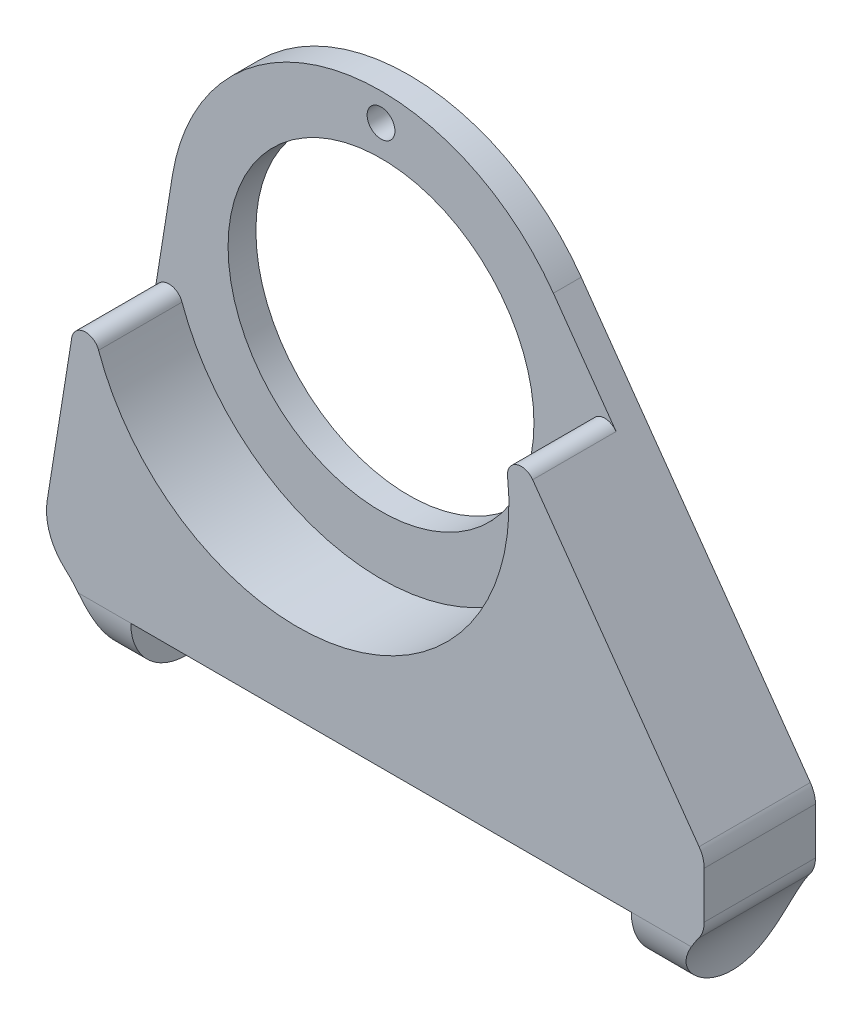
ISO-10303-21;
HEADER;
FILE_DESCRIPTION(('STEP AP214'),'2;1');
FILE_NAME('part.step','',(''),(''),'','','');
FILE_SCHEMA(('AUTOMOTIVE_DESIGN { 1 0 10303 214 1 1 1 1 }'));
ENDSEC;
DATA;
#1=APPLICATION_CONTEXT('core data for automotive mechanical design processes');
#2=APPLICATION_PROTOCOL_DEFINITION('international standard','automotive_design',2000,#1);
#3=PRODUCT_CONTEXT('',#1,'mechanical');
#4=PRODUCT('Part','Part','',(#3));
#5=PRODUCT_RELATED_PRODUCT_CATEGORY('part','',(#4));
#6=PRODUCT_DEFINITION_FORMATION('','',#4);
#7=PRODUCT_DEFINITION_CONTEXT('part definition',#1,'design');
#8=PRODUCT_DEFINITION('design','',#6,#7);
#9=PRODUCT_DEFINITION_SHAPE('','',#8);
#10=(LENGTH_UNIT() NAMED_UNIT(*) SI_UNIT(.MILLI.,.METRE.));
#11=(NAMED_UNIT(*) PLANE_ANGLE_UNIT() SI_UNIT($,.RADIAN.));
#12=(NAMED_UNIT(*) SI_UNIT($,.STERADIAN.) SOLID_ANGLE_UNIT());
#13=UNCERTAINTY_MEASURE_WITH_UNIT(LENGTH_MEASURE(1.E-05),#10,'distance_accuracy_value','');
#14=(GEOMETRIC_REPRESENTATION_CONTEXT(3) GLOBAL_UNCERTAINTY_ASSIGNED_CONTEXT((#13)) GLOBAL_UNIT_ASSIGNED_CONTEXT((#10,
#11,#12)) REPRESENTATION_CONTEXT('',''));
#15=CARTESIAN_POINT('',(0.,0.,0.));
#16=DIRECTION('',(0.,0.,1.));
#17=DIRECTION('',(1.,0.,0.));
#18=AXIS2_PLACEMENT_3D('',#15,#16,#17);
#19=CARTESIAN_POINT('',(-35.1529531364286,-52.3924267994827,10.));
#20=DIRECTION('',(-1.,0.,0.));
#21=DIRECTION('',(0.,0.,1.));
#22=AXIS2_PLACEMENT_3D('',#19,#20,#21);
#23=CYLINDRICAL_SURFACE('',#22,10.);
#24=CARTESIAN_POINT('',(-30.,-52.3924267994827,10.));
#25=DIRECTION('',(1.,0.,0.));
#26=DIRECTION('',(0.,0.,-1.));
#27=AXIS2_PLACEMENT_3D('',#24,#25,#26);
#28=CIRCLE('',#27,10.);
#29=CARTESIAN_POINT('',(-30.,-52.3924267994827,20.));
#30=VERTEX_POINT('',#29);
#31=CARTESIAN_POINT('',(-30.,-52.3924267994827,0.));
#32=VERTEX_POINT('',#31);
#33=EDGE_CURVE('E53',#30,#32,#28,.T.);
#34=ORIENTED_EDGE('',*,*,#33,.F.);
#35=DIRECTION('',(-1.,0.,0.));
#36=VECTOR('',#35,1.);
#37=CARTESIAN_POINT('',(73.1163853827035,-52.3924267994827,20.));
#38=LINE('',#37,#36);
#39=CARTESIAN_POINT('',(-39.4299255812802,-52.3924267994827,20.));
#40=VERTEX_POINT('',#39);
#41=EDGE_CURVE('E79',#30,#40,#38,.T.);
#42=ORIENTED_EDGE('',*,*,#41,.T.);
#43=CARTESIAN_POINT('',(-39.4299255812802,-52.3924267994827,20.));
#44=CARTESIAN_POINT('',(-39.3366220687245,-52.5111090935359,19.999999330762));
#45=CARTESIAN_POINT('',(-39.24467044055,-52.6308414926383,19.9978867756354));
#46=CARTESIAN_POINT('',(-39.0635651683623,-52.8722661888648,19.9892118401067));
#47=CARTESIAN_POINT('',(-38.9744118554305,-52.9939587153422,19.9826489352244));
#48=CARTESIAN_POINT('',(-38.7112010580915,-53.3618944527533,19.9559338374954));
#49=CARTESIAN_POINT('',(-38.5415230671002,-53.6108299610111,19.9287546283468));
#50=CARTESIAN_POINT('',(-38.2141961091669,-54.1150033123771,19.8538296248108));
#51=CARTESIAN_POINT('',(-38.0566011857026,-54.3702633990138,19.8059971317999));
#52=CARTESIAN_POINT('',(-37.7551381261347,-54.8837289905072,19.6882789131739));
#53=CARTESIAN_POINT('',(-37.6112658299277,-55.1419335759745,19.6183998989558));
#54=CARTESIAN_POINT('',(-37.337041982633,-55.6602630431236,19.4549214072005));
#55=CARTESIAN_POINT('',(-37.206779830574,-55.9203899019105,19.3611774892748));
#56=CARTESIAN_POINT('',(-36.9612170584597,-56.4378931862962,19.1494455626398));
#57=CARTESIAN_POINT('',(-36.8459179623069,-56.6952693293047,19.0314550877127));
#58=CARTESIAN_POINT('',(-36.6306784301974,-57.2031914428053,18.7714144832709));
#59=CARTESIAN_POINT('',(-36.5306954580004,-57.4537546794312,18.6294333785582));
#60=CARTESIAN_POINT('',(-36.3453921120126,-57.9454151265018,18.3215633905807));
#61=CARTESIAN_POINT('',(-36.2600698617295,-58.186513545339,18.1556775719935));
#62=CARTESIAN_POINT('',(-36.1119931287387,-58.6301660327219,17.820435877087));
#63=CARTESIAN_POINT('',(-36.047788994485,-58.8340442238142,17.6534646886783));
#64=CARTESIAN_POINT('',(-35.9297092648523,-59.2295669854497,17.302289933838));
#65=CARTESIAN_POINT('',(-35.8758329348111,-59.4212124255151,17.118087594522));
#66=CARTESIAN_POINT('',(-35.7774794187983,-59.7904884227159,16.7334855491487));
#67=CARTESIAN_POINT('',(-35.7330108380044,-59.9681060565027,16.5330712437638));
#68=CARTESIAN_POINT('',(-35.6525377802396,-60.3074104750995,16.1175952172354));
#69=CARTESIAN_POINT('',(-35.6165333742724,-60.4690971262621,15.9025333732371));
#70=CARTESIAN_POINT('',(-35.5526016134226,-60.7719394942125,15.4638235635278));
#71=CARTESIAN_POINT('',(-35.5245249144532,-60.9134458175753,15.2404390893383));
#72=CARTESIAN_POINT('',(-35.4745153004868,-61.1785727884145,14.7826362580631));
#73=CARTESIAN_POINT('',(-35.4525825499257,-61.3021929571453,14.5482176058562));
#74=CARTESIAN_POINT('',(-35.4139496661938,-61.5305073230335,14.0700902435148));
#75=CARTESIAN_POINT('',(-35.3972466519187,-61.6352119274321,13.8263867317886));
#76=CARTESIAN_POINT('',(-35.3682272372887,-61.8249937029222,13.3312124819461));
#77=CARTESIAN_POINT('',(-35.3559105902715,-61.910071977583,13.0797421814507));
#78=CARTESIAN_POINT('',(-35.3360170379392,-62.0524279388327,12.5964005008844));
#79=CARTESIAN_POINT('',(-35.3280872687199,-62.111644621117,12.3651120016741));
#80=CARTESIAN_POINT('',(-35.3147954543811,-62.2133946360928,11.8988233216591));
#81=CARTESIAN_POINT('',(-35.3094333460893,-62.2559283792309,11.6638232323177));
#82=CARTESIAN_POINT('',(-35.3009747579725,-62.3240869305703,11.1912727111729));
#83=CARTESIAN_POINT('',(-35.2978789445011,-62.349706765396,10.9537215500989));
#84=CARTESIAN_POINT('',(-35.2937731257563,-62.3838747053766,10.4774514992262));
#85=CARTESIAN_POINT('',(-35.2927625345312,-62.3924276063522,10.2387329563691));
#86=CARTESIAN_POINT('',(-35.2927614323456,-62.3924258624867,9.72276576464788));
#87=CARTESIAN_POINT('',(-35.2941229912089,-62.3808897719434,9.44551209186838));
#88=CARTESIAN_POINT('',(-35.2996802521267,-62.3348251802097,8.89293269610677));
#89=CARTESIAN_POINT('',(-35.3038762294533,-62.3002944458376,8.61760716300533));
#90=CARTESIAN_POINT('',(-35.3154382550796,-62.2084761345348,8.07073178578457));
#91=CARTESIAN_POINT('',(-35.3228055184301,-62.151179835823,7.7991834300664));
#92=CARTESIAN_POINT('',(-35.3412521656007,-62.0142617900652,7.26190902567436));
#93=CARTESIAN_POINT('',(-35.3523314579926,-61.9346405928944,6.99618283377104));
#94=CARTESIAN_POINT('',(-35.3789403116224,-61.7536430334011,6.47232934056427));
#95=CARTESIAN_POINT('',(-35.3944719889064,-61.6522563325446,6.21420571694398));
#96=CARTESIAN_POINT('',(-35.4308782865302,-61.4285620319465,5.7075721210572));
#97=CARTESIAN_POINT('',(-35.451752948939,-61.3062542674811,5.45906222450413));
#98=CARTESIAN_POINT('',(-35.499864672064,-61.0417492794358,4.97350531397001));
#99=CARTESIAN_POINT('',(-35.5271016509476,-60.8995523116812,4.73645815260205));
#100=CARTESIAN_POINT('',(-35.5890370346288,-60.5965349669535,4.27560897065876));
#101=CARTESIAN_POINT('',(-35.6237352929582,-60.4357149555874,4.05180669019067));
#102=CARTESIAN_POINT('',(-35.7011452070237,-60.0994538527645,3.62230238864861));
#103=CARTESIAN_POINT('',(-35.7437320986142,-59.9242613062654,3.41638333297936));
#104=CARTESIAN_POINT('',(-35.8382795944468,-59.5589788019134,3.020525794144));
#105=CARTESIAN_POINT('',(-35.8902400902045,-59.3688890164864,2.83058712606804));
#106=CARTESIAN_POINT('',(-36.0044200820581,-58.9759544555626,2.46816548777445));
#107=CARTESIAN_POINT('',(-36.066629628696,-58.7731221670862,2.29566584781051));
#108=CARTESIAN_POINT('',(-36.2021224342907,-58.3567062262291,1.9689727859117));
#109=CARTESIAN_POINT('',(-36.2754053607824,-58.1431228967639,1.81477881461894));
#110=CARTESIAN_POINT('',(-36.4311253860051,-57.7143901896846,1.53000341620893));
#111=CARTESIAN_POINT('',(-36.513202059612,-57.4995013659541,1.39883184568163));
#112=CARTESIAN_POINT('',(-36.6885801980579,-57.06402189573,1.15474675541451));
#113=CARTESIAN_POINT('',(-36.7818815311617,-56.8434313161774,1.04183302143312));
#114=CARTESIAN_POINT('',(-36.9799753794039,-56.3983280641732,0.834129215583045));
#115=CARTESIAN_POINT('',(-37.0847891845043,-56.1738087933166,0.739373642427734));
#116=CARTESIAN_POINT('',(-37.3056219132202,-55.7233951181868,0.567994840542597));
#117=CARTESIAN_POINT('',(-37.4216406497058,-55.4975007369377,0.491371309069431));
#118=CARTESIAN_POINT('',(-37.6762977301332,-55.0245189216058,0.34915475246827));
#119=CARTESIAN_POINT('',(-37.8160384741735,-54.7774902854037,0.285340103366601));
#120=CARTESIAN_POINT('',(-38.1080248933137,-54.2863923096206,0.177773990856303));
#121=CARTESIAN_POINT('',(-38.2602749850421,-54.0423240504557,0.134029649798268));
#122=CARTESIAN_POINT('',(-38.5759938023086,-53.559931285277,0.0654085401826111));
#123=CARTESIAN_POINT('',(-38.7394280674642,-53.3215919448294,0.0404764308406096));
#124=CARTESIAN_POINT('',(-39.0769076558199,-52.851644437408,0.00777193775637778));
#125=CARTESIAN_POINT('',(-39.2509432577528,-52.6200303829376,-1.59306423918359E-05));
#126=CARTESIAN_POINT('',(-39.4299255812802,-52.3924267994827,0.));
#127=B_SPLINE_CURVE_WITH_KNOTS('',3,(#43,#44,#45,#46,#47,#48,#49,#50,#51,#52,#53,#54,#55,#56,
#57,#58,#59,#60,#61,#62,#63,#64,#65,#66,#67,#68,#69,#70,#71,#72,#73,#74,#75,#76,#77,#78,#79,#80,
#81,#82,#83,#84,#85,#86,#87,#88,#89,#90,#91,#92,#93,#94,#95,#96,#97,#98,#99,#100,#101,#102,#103,
#104,#105,#106,#107,#108,#109,#110,#111,#112,#113,#114,#115,#116,#117,#118,#119,#120,#121,#122,
#123,#124,#125,#126),.UNSPECIFIED.,.F.,.F.,(4,2,2,2,2,2,2,2,2,2,2,2,2,2,2,2,2,2,2,2,2,2,2,2,2,2,
2,2,2,2,2,2,2,2,2,2,2,2,2,2,2,4),(0.,0.45285286404265,0.905759106730109,1.81220282585273,
2.72248919414524,3.63249872022485,4.54815268117253,5.46389982322623,6.37705573395974,
7.29009467851965,8.10279617676342,8.91543984249555,9.72882364215702,10.5422142648322,
11.3390663708785,12.1359398017401,12.9323734529397,13.7287623105397,14.4447893815855,
15.1607988352723,15.8770187311405,16.5930373403471,17.4245307153729,18.2561048547092,
19.0879978884756,19.9198704340379,20.7521389937399,21.5844141066831,22.416678515454,
23.2489265880069,24.068989521644,24.8890429649872,25.7083049668534,26.5275423762351,
27.3210122643684,28.1144728410712,28.9094262849189,29.7043664548151,30.5760305025076,
31.4480036388391,32.3174015431783,33.1860138857131),.UNSPECIFIED.);
#128=CARTESIAN_POINT('',(-39.4299255812801,-52.3924267994827,0.));
#129=VERTEX_POINT('',#128);
#130=EDGE_CURVE('E180',#40,#129,#127,.T.);
#131=ORIENTED_EDGE('',*,*,#130,.T.);
#132=DIRECTION('',(-1.,0.,0.));
#133=VECTOR('',#132,1.);
#134=CARTESIAN_POINT('',(73.1163853827035,-52.3924267994827,0.));
#135=LINE('',#134,#133);
#136=EDGE_CURVE('E87',#32,#129,#135,.T.);
#137=ORIENTED_EDGE('',*,*,#136,.F.);
#138=EDGE_LOOP('',(#34,#42,#131,#137));
#139=FACE_BOUND('',#138,.T.);
#140=ADVANCED_FACE('F44',(#139),#23,.T.);
#141=CARTESIAN_POINT('',(0.,0.,5.));
#142=DIRECTION('',(0.,0.,-1.));
#143=DIRECTION('',(-1.,0.,0.));
#144=AXIS2_PLACEMENT_3D('',#141,#142,#143);
#145=CYLINDRICAL_SURFACE('',#144,38.);
#146=DIRECTION('',(0.,0.,-1.));
#147=VECTOR('',#146,1.);
#148=CARTESIAN_POINT('',(-37.5209884030344,6.01460133835652,5.));
#149=LINE('',#148,#147);
#150=CARTESIAN_POINT('',(-37.5209884030344,6.01460133835652,5.));
#151=VERTEX_POINT('',#150);
#152=CARTESIAN_POINT('',(-37.5209884030344,6.01460133835652,0.));
#153=VERTEX_POINT('',#152);
#154=EDGE_CURVE('E216',#151,#153,#149,.T.);
#155=ORIENTED_EDGE('',*,*,#154,.F.);
#156=CARTESIAN_POINT('',(0.,0.,5.));
#157=DIRECTION('',(0.,0.,1.));
#158=DIRECTION('',(1.,0.,0.));
#159=AXIS2_PLACEMENT_3D('',#156,#157,#158);
#160=CIRCLE('',#159,38.);
#161=CARTESIAN_POINT('',(30.9950052682842,21.9843045925732,5.));
#162=VERTEX_POINT('',#161);
#163=EDGE_CURVE('E207',#162,#151,#160,.T.);
#164=ORIENTED_EDGE('',*,*,#163,.F.);
#165=DIRECTION('',(0.,0.,-1.));
#166=VECTOR('',#165,1.);
#167=CARTESIAN_POINT('',(30.9950052682842,21.9843045925732,5.));
#168=LINE('',#167,#166);
#169=CARTESIAN_POINT('',(30.9950052682842,21.9843045925732,0.));
#170=VERTEX_POINT('',#169);
#171=EDGE_CURVE('E210',#162,#170,#168,.T.);
#172=ORIENTED_EDGE('',*,*,#171,.T.);
#173=CARTESIAN_POINT('',(0.,0.,0.));
#174=DIRECTION('',(0.,0.,1.));
#175=DIRECTION('',(1.,0.,0.));
#176=AXIS2_PLACEMENT_3D('',#173,#174,#175);
#177=CIRCLE('',#176,38.);
#178=EDGE_CURVE('E204',#170,#153,#177,.T.);
#179=ORIENTED_EDGE('',*,*,#178,.T.);
#180=EDGE_LOOP('',(#155,#164,#172,#179));
#181=FACE_BOUND('',#180,.T.);
#182=ADVANCED_FACE('F311',(#181),#145,.T.);
#183=CARTESIAN_POINT('',(0.,0.,5.));
#184=DIRECTION('',(0.,0.,1.));
#185=DIRECTION('',(1.,0.,0.));
#186=AXIS2_PLACEMENT_3D('',#183,#184,#185);
#187=PLANE('',#186);
#188=CARTESIAN_POINT('',(0.,33.,5.));
#189=DIRECTION('',(0.,0.,1.));
#190=DIRECTION('',(1.,0.,0.));
#191=AXIS2_PLACEMENT_3D('',#188,#189,#190);
#192=CIRCLE('',#191,2.5);
#193=CARTESIAN_POINT('',(2.5,33.,5.));
#194=VERTEX_POINT('',#193);
#195=EDGE_CURVE('E201',#194,#194,#192,.T.);
#196=ORIENTED_EDGE('',*,*,#195,.F.);
#197=EDGE_LOOP('',(#196));
#198=FACE_BOUND('',#197,.T.);
#199=ORIENTED_EDGE('',*,*,#163,.T.);
#200=DIRECTION('',(0.158278982588329,0.987394431658799,0.));
#201=VECTOR('',#200,1.);
#202=CARTESIAN_POINT('',(-46.8836146172965,-52.3924267994827,5.));
#203=LINE('',#202,#201);
#204=CARTESIAN_POINT('',(-40.6064137878225,-13.2332595868192,5.));
#205=VERTEX_POINT('',#204);
#206=EDGE_CURVE('E234',#205,#151,#203,.T.);
#207=ORIENTED_EDGE('',*,*,#206,.F.);
#208=CARTESIAN_POINT('',(-38.1379277086755,-13.62895704329,5.));
#209=DIRECTION('',(0.,0.,1.));
#210=DIRECTION('',(1.,0.,0.));
#211=AXIS2_PLACEMENT_3D('',#208,#209,#210);
#212=CIRCLE('',#211,2.5);
#213=CARTESIAN_POINT('',(-35.7837346402387,-12.7876633986425,5.));
#214=VERTEX_POINT('',#213);
#215=EDGE_CURVE('E241',#205,#214,#212,.F.);
#216=ORIENTED_EDGE('',*,*,#215,.T.);
#217=CARTESIAN_POINT('',(37.7500167500985,4.35157849145371,5.));
#218=VERTEX_POINT('',#217);
#219=EDGE_CURVE('E211',#214,#218,#160,.T.);
#220=ORIENTED_EDGE('',*,*,#219,.T.);
#221=CARTESIAN_POINT('',(40.2335704836576,4.63786655010198,5.));
#222=DIRECTION('',(0.,0.,1.));
#223=DIRECTION('',(1.,0.,0.));
#224=AXIS2_PLACEMENT_3D('',#221,#222,#223);
#225=CIRCLE('',#224,2.5);
#226=CARTESIAN_POINT('',(42.2727155670974,6.08420237856073,5.));
#227=VERTEX_POINT('',#226);
#228=EDGE_CURVE('E239',#218,#227,#225,.F.);
#229=ORIENTED_EDGE('',*,*,#228,.T.);
#230=DIRECTION('',(0.578534331383504,-0.815658033375901,0.));
#231=VECTOR('',#230,1.);
#232=CARTESIAN_POINT('',(30.9950052682842,21.9843045925732,5.));
#233=LINE('',#232,#231);
#234=EDGE_CURVE('E226',#162,#227,#233,.T.);
#235=ORIENTED_EDGE('',*,*,#234,.F.);
#236=EDGE_LOOP('',(#199,#207,#216,#220,#229,#235));
#237=FACE_BOUND('',#236,.T.);
#238=CARTESIAN_POINT('',(0.,0.,5.));
#239=DIRECTION('',(0.,0.,1.));
#240=DIRECTION('',(1.,0.,0.));
#241=AXIS2_PLACEMENT_3D('',#238,#239,#240);
#242=CIRCLE('',#241,27.5);
#243=CARTESIAN_POINT('',(27.5,0.,5.));
#244=VERTEX_POINT('',#243);
#245=EDGE_CURVE('E193',#244,#244,#242,.T.);
#246=ORIENTED_EDGE('',*,*,#245,.F.);
#247=EDGE_LOOP('',(#246));
#248=FACE_BOUND('',#247,.T.);
#249=ADVANCED_FACE('F314',(#198,#237,#248),#187,.T.);
#250=CARTESIAN_POINT('',(0.,0.,0.));
#251=DIRECTION('',(0.,0.,1.));
#252=DIRECTION('',(1.,0.,0.));
#253=AXIS2_PLACEMENT_3D('',#250,#251,#252);
#254=PLANE('',#253);
#255=DIRECTION('',(0.,-1.,0.));
#256=VECTOR('',#255,1.);
#257=CARTESIAN_POINT('',(73.1163853827035,-37.4013536190073,0.));
#258=LINE('',#257,#256);
#259=CARTESIAN_POINT('',(73.1163853827035,-38.9945344954409,0.));
#260=VERTEX_POINT('',#259);
#261=CARTESIAN_POINT('',(73.1163853827035,-47.3924267994827,0.));
#262=VERTEX_POINT('',#261);
#263=EDGE_CURVE('E182',#260,#262,#258,.T.);
#264=ORIENTED_EDGE('',*,*,#263,.T.);
#265=CARTESIAN_POINT('',(68.1163853827035,-47.3924267994827,0.));
#266=DIRECTION('',(0.,0.,1.));
#267=DIRECTION('',(1.,0.,0.));
#268=AXIS2_PLACEMENT_3D('',#265,#266,#267);
#269=CIRCLE('',#268,5.);
#270=CARTESIAN_POINT('',(72.1163853827035,-50.3924267994827,0.));
#271=VERTEX_POINT('',#270);
#272=EDGE_CURVE('E257',#262,#271,#269,.F.);
#273=ORIENTED_EDGE('',*,*,#272,.T.);
#274=CARTESIAN_POINT('',(88.1163853827035,-62.3924267994827,0.));
#275=DIRECTION('',(0.,0.,1.));
#276=DIRECTION('',(1.,0.,0.));
#277=AXIS2_PLACEMENT_3D('',#274,#275,#276);
#278=CIRCLE('',#277,20.);
#279=CARTESIAN_POINT('',(70.7958773070147,-52.3924267994827,0.));
#280=VERTEX_POINT('',#279);
#281=EDGE_CURVE('E406',#271,#280,#278,.T.);
#282=ORIENTED_EDGE('',*,*,#281,.T.);
#283=CARTESIAN_POINT('',(60.,-52.3924267994827,0.));
#284=VERTEX_POINT('',#283);
#285=EDGE_CURVE('E67',#280,#284,#135,.T.);
#286=ORIENTED_EDGE('',*,*,#285,.T.);
#287=EDGE_CURVE('E173',#284,#32,#135,.T.);
#288=ORIENTED_EDGE('',*,*,#287,.T.);
#289=ORIENTED_EDGE('',*,*,#136,.T.);
#290=CARTESIAN_POINT('',(-55.1529531364286,-64.7531065744806,0.));
#291=DIRECTION('',(0.,0.,1.));
#292=DIRECTION('',(1.,0.,0.));
#293=AXIS2_PLACEMENT_3D('',#290,#291,#292);
#294=CIRCLE('',#293,20.);
#295=CARTESIAN_POINT('',(-41.8196198030953,-49.845986724482,0.));
#296=VERTEX_POINT('',#295);
#297=EDGE_CURVE('E279',#129,#296,#294,.T.);
#298=ORIENTED_EDGE('',*,*,#297,.T.);
#299=CARTESIAN_POINT('',(-35.1529531364286,-42.3924267994827,0.));
#300=DIRECTION('',(0.,0.,1.));
#301=DIRECTION('',(1.,0.,0.));
#302=AXIS2_PLACEMENT_3D('',#299,#300,#301);
#303=CIRCLE('',#302,10.);
#304=CARTESIAN_POINT('',(-45.0268974530166,-40.8096369735994,0.));
#305=VERTEX_POINT('',#304);
#306=EDGE_CURVE('E243',#296,#305,#303,.F.);
#307=ORIENTED_EDGE('',*,*,#306,.T.);
#308=DIRECTION('',(0.158278982588329,0.987394431658799,0.));
#309=VECTOR('',#308,1.);
#310=CARTESIAN_POINT('',(-46.8836146172965,-52.3924267994827,0.));
#311=LINE('',#310,#309);
#312=EDGE_CURVE('E187',#305,#153,#311,.T.);
#313=ORIENTED_EDGE('',*,*,#312,.T.);
#314=ORIENTED_EDGE('',*,*,#178,.F.);
#315=DIRECTION('',(0.578534331383504,-0.815658033375901,0.));
#316=VECTOR('',#315,1.);
#317=CARTESIAN_POINT('',(30.9950052682842,21.9843045925732,0.));
#318=LINE('',#317,#316);
#319=CARTESIAN_POINT('',(72.194675549583,-36.1018628385234,0.));
#320=VERTEX_POINT('',#319);
#321=EDGE_CURVE('E373',#170,#320,#318,.T.);
#322=ORIENTED_EDGE('',*,*,#321,.T.);
#323=CARTESIAN_POINT('',(68.1163853827035,-38.9945344954409,0.));
#324=DIRECTION('',(0.,0.,1.));
#325=DIRECTION('',(1.,0.,0.));
#326=AXIS2_PLACEMENT_3D('',#323,#324,#325);
#327=CIRCLE('',#326,5.);
#328=EDGE_CURVE('E255',#320,#260,#327,.F.);
#329=ORIENTED_EDGE('',*,*,#328,.T.);
#330=EDGE_LOOP('',(#264,#273,#282,#286,#288,#289,#298,#307,#313,#314,#322,#329));
#331=FACE_BOUND('',#330,.T.);
#332=CARTESIAN_POINT('',(0.,33.,0.));
#333=DIRECTION('',(0.,0.,1.));
#334=DIRECTION('',(1.,0.,0.));
#335=AXIS2_PLACEMENT_3D('',#332,#333,#334);
#336=CIRCLE('',#335,2.5);
#337=CARTESIAN_POINT('',(2.5,33.,0.));
#338=VERTEX_POINT('',#337);
#339=EDGE_CURVE('E196',#338,#338,#336,.T.);
#340=ORIENTED_EDGE('',*,*,#339,.T.);
#341=EDGE_LOOP('',(#340));
#342=FACE_BOUND('',#341,.T.);
#343=CARTESIAN_POINT('',(0.,0.,0.));
#344=DIRECTION('',(0.,0.,1.));
#345=DIRECTION('',(1.,0.,0.));
#346=AXIS2_PLACEMENT_3D('',#343,#344,#345);
#347=CIRCLE('',#346,27.5);
#348=CARTESIAN_POINT('',(27.5,0.,0.));
#349=VERTEX_POINT('',#348);
#350=EDGE_CURVE('E197',#349,#349,#347,.T.);
#351=ORIENTED_EDGE('',*,*,#350,.T.);
#352=EDGE_LOOP('',(#351));
#353=FACE_BOUND('',#352,.T.);
#354=ADVANCED_FACE('F185',(#331,#342,#353),#254,.F.);
#355=CARTESIAN_POINT('',(0.,33.,5.));
#356=DIRECTION('',(0.,0.,-1.));
#357=DIRECTION('',(-1.,0.,0.));
#358=AXIS2_PLACEMENT_3D('',#355,#356,#357);
#359=CYLINDRICAL_SURFACE('',#358,2.5);
#360=ORIENTED_EDGE('',*,*,#195,.T.);
#361=EDGE_LOOP('',(#360));
#362=FACE_BOUND('',#361,.T.);
#363=ORIENTED_EDGE('',*,*,#339,.F.);
#364=EDGE_LOOP('',(#363));
#365=FACE_BOUND('',#364,.T.);
#366=ADVANCED_FACE('F318',(#362,#365),#359,.F.);
#367=CARTESIAN_POINT('',(0.,0.,5.));
#368=DIRECTION('',(0.,0.,-1.));
#369=DIRECTION('',(-1.,0.,0.));
#370=AXIS2_PLACEMENT_3D('',#367,#368,#369);
#371=CYLINDRICAL_SURFACE('',#370,27.5);
#372=ORIENTED_EDGE('',*,*,#245,.T.);
#373=EDGE_LOOP('',(#372));
#374=FACE_BOUND('',#373,.T.);
#375=ORIENTED_EDGE('',*,*,#350,.F.);
#376=EDGE_LOOP('',(#375));
#377=FACE_BOUND('',#376,.T.);
#378=ADVANCED_FACE('F324',(#374,#377),#371,.F.);
#379=CARTESIAN_POINT('',(0.,0.,20.));
#380=DIRECTION('',(0.,0.,-1.));
#381=DIRECTION('',(-1.,0.,0.));
#382=AXIS2_PLACEMENT_3D('',#379,#380,#381);
#383=CYLINDRICAL_SURFACE('',#382,38.);
#384=CARTESIAN_POINT('',(0.,0.,20.));
#385=DIRECTION('',(0.,0.,1.));
#386=DIRECTION('',(-1.,0.,0.));
#387=AXIS2_PLACEMENT_3D('',#384,#385,#386);
#388=CIRCLE('',#387,38.);
#389=CARTESIAN_POINT('',(-35.7837346402387,-12.7876633986425,20.));
#390=VERTEX_POINT('',#389);
#391=CARTESIAN_POINT('',(37.7500167500985,4.35157849145371,20.));
#392=VERTEX_POINT('',#391);
#393=EDGE_CURVE('E192',#390,#392,#388,.T.);
#394=ORIENTED_EDGE('',*,*,#393,.T.);
#395=DIRECTION('',(0.,0.,-1.));
#396=VECTOR('',#395,1.);
#397=CARTESIAN_POINT('',(37.7500167500985,4.35157849145371,20.));
#398=LINE('',#397,#396);
#399=EDGE_CURVE('E221',#392,#218,#398,.T.);
#400=ORIENTED_EDGE('',*,*,#399,.T.);
#401=ORIENTED_EDGE('',*,*,#219,.F.);
#402=DIRECTION('',(0.,0.,-1.));
#403=VECTOR('',#402,1.);
#404=CARTESIAN_POINT('',(-35.7837346402387,-12.7876633986425,20.));
#405=LINE('',#404,#403);
#406=EDGE_CURVE('E219',#214,#390,#405,.F.);
#407=ORIENTED_EDGE('',*,*,#406,.T.);
#408=EDGE_LOOP('',(#394,#400,#401,#407));
#409=FACE_BOUND('',#408,.T.);
#410=ADVANCED_FACE('F328',(#409),#383,.F.);
#411=CARTESIAN_POINT('',(-46.8836146172965,-52.3924267994827,20.));
#412=DIRECTION('',(-0.987394431658799,0.158278982588329,0.));
#413=DIRECTION('',(-0.158278982588329,-0.987394431658799,0.));
#414=AXIS2_PLACEMENT_3D('',#411,#412,#413);
#415=PLANE('',#414);
#416=ORIENTED_EDGE('',*,*,#312,.F.);
#417=DIRECTION('',(0.,0.,-1.));
#418=VECTOR('',#417,1.);
#419=CARTESIAN_POINT('',(-45.0268974530166,-40.8096369735994,20.));
#420=LINE('',#419,#418);
#421=CARTESIAN_POINT('',(-45.0268974530166,-40.8096369735994,20.));
#422=VERTEX_POINT('',#421);
#423=EDGE_CURVE('E245',#305,#422,#420,.F.);
#424=ORIENTED_EDGE('',*,*,#423,.T.);
#425=DIRECTION('',(0.158278982588329,0.987394431658799,0.));
#426=VECTOR('',#425,1.);
#427=CARTESIAN_POINT('',(-46.8836146172965,-52.3924267994827,20.));
#428=LINE('',#427,#426);
#429=CARTESIAN_POINT('',(-40.6064137878225,-13.2332595868192,20.));
#430=VERTEX_POINT('',#429);
#431=EDGE_CURVE('E200',#422,#430,#428,.T.);
#432=ORIENTED_EDGE('',*,*,#431,.T.);
#433=DIRECTION('',(0.,0.,-1.));
#434=VECTOR('',#433,1.);
#435=CARTESIAN_POINT('',(-40.6064137878225,-13.2332595868192,20.));
#436=LINE('',#435,#434);
#437=EDGE_CURVE('E236',#430,#205,#436,.T.);
#438=ORIENTED_EDGE('',*,*,#437,.T.);
#439=ORIENTED_EDGE('',*,*,#206,.T.);
#440=ORIENTED_EDGE('',*,*,#154,.T.);
#441=EDGE_LOOP('',(#416,#424,#432,#438,#439,#440));
#442=FACE_BOUND('',#441,.T.);
#443=ADVANCED_FACE('F332',(#442),#415,.T.);
#444=CARTESIAN_POINT('',(73.1163853827035,-37.4013536190073,20.));
#445=DIRECTION('',(1.,0.,0.));
#446=DIRECTION('',(0.,0.,-1.));
#447=AXIS2_PLACEMENT_3D('',#444,#445,#446);
#448=PLANE('',#447);
#449=DIRECTION('',(0.,-1.,0.));
#450=VECTOR('',#449,1.);
#451=CARTESIAN_POINT('',(73.1163853827035,-37.4013536190073,20.));
#452=LINE('',#451,#450);
#453=CARTESIAN_POINT('',(73.1163853827035,-38.9945344954409,20.));
#454=VERTEX_POINT('',#453);
#455=CARTESIAN_POINT('',(73.1163853827035,-47.3924267994827,20.));
#456=VERTEX_POINT('',#455);
#457=EDGE_CURVE('E363',#454,#456,#452,.T.);
#458=ORIENTED_EDGE('',*,*,#457,.T.);
#459=DIRECTION('',(0.,0.,-1.));
#460=VECTOR('',#459,1.);
#461=CARTESIAN_POINT('',(73.1163853827035,-47.3924267994827,20.));
#462=LINE('',#461,#460);
#463=EDGE_CURVE('E252',#456,#262,#462,.T.);
#464=ORIENTED_EDGE('',*,*,#463,.T.);
#465=ORIENTED_EDGE('',*,*,#263,.F.);
#466=DIRECTION('',(0.,0.,-1.));
#467=VECTOR('',#466,1.);
#468=CARTESIAN_POINT('',(73.1163853827035,-38.9945344954409,20.));
#469=LINE('',#468,#467);
#470=EDGE_CURVE('E250',#260,#454,#469,.F.);
#471=ORIENTED_EDGE('',*,*,#470,.T.);
#472=EDGE_LOOP('',(#458,#464,#465,#471));
#473=FACE_BOUND('',#472,.T.);
#474=ADVANCED_FACE('F337',(#473),#448,.T.);
#475=CARTESIAN_POINT('',(30.9950052682842,21.9843045925732,20.));
#476=DIRECTION('',(0.815658033375901,0.578534331383504,0.));
#477=DIRECTION('',(-0.578534331383504,0.815658033375901,0.));
#478=AXIS2_PLACEMENT_3D('',#475,#476,#477);
#479=PLANE('',#478);
#480=DIRECTION('',(0.578534331383504,-0.815658033375901,0.));
#481=VECTOR('',#480,1.);
#482=CARTESIAN_POINT('',(30.9950052682842,21.9843045925732,20.));
#483=LINE('',#482,#481);
#484=CARTESIAN_POINT('',(42.2727155670974,6.08420237856072,20.));
#485=VERTEX_POINT('',#484);
#486=CARTESIAN_POINT('',(72.194675549583,-36.1018628385234,20.));
#487=VERTEX_POINT('',#486);
#488=EDGE_CURVE('E365',#485,#487,#483,.T.);
#489=ORIENTED_EDGE('',*,*,#488,.T.);
#490=DIRECTION('',(0.,0.,-1.));
#491=VECTOR('',#490,1.);
#492=CARTESIAN_POINT('',(72.194675549583,-36.1018628385233,20.));
#493=LINE('',#492,#491);
#494=EDGE_CURVE('E264',#487,#320,#493,.T.);
#495=ORIENTED_EDGE('',*,*,#494,.T.);
#496=ORIENTED_EDGE('',*,*,#321,.F.);
#497=ORIENTED_EDGE('',*,*,#171,.F.);
#498=ORIENTED_EDGE('',*,*,#234,.T.);
#499=DIRECTION('',(0.,0.,-1.));
#500=VECTOR('',#499,1.);
#501=CARTESIAN_POINT('',(42.2727155670974,6.08420237856073,20.));
#502=LINE('',#501,#500);
#503=EDGE_CURVE('E224',#227,#485,#502,.F.);
#504=ORIENTED_EDGE('',*,*,#503,.T.);
#505=EDGE_LOOP('',(#489,#495,#496,#497,#498,#504));
#506=FACE_BOUND('',#505,.T.);
#507=ADVANCED_FACE('F334',(#506),#479,.T.);
#508=CARTESIAN_POINT('',(0.,0.,20.));
#509=DIRECTION('',(0.,0.,-1.));
#510=DIRECTION('',(-1.,0.,0.));
#511=AXIS2_PLACEMENT_3D('',#508,#509,#510);
#512=PLANE('',#511);
#513=CARTESIAN_POINT('',(70.7958773070147,-52.3924267994827,20.));
#514=VERTEX_POINT('',#513);
#515=CARTESIAN_POINT('',(60.,-52.3924267994827,20.));
#516=VERTEX_POINT('',#515);
#517=EDGE_CURVE('E356',#514,#516,#38,.T.);
#518=ORIENTED_EDGE('',*,*,#517,.F.);
#519=CARTESIAN_POINT('',(88.1163853827035,-62.3924267994827,20.));
#520=DIRECTION('',(0.,0.,-1.));
#521=DIRECTION('',(-1.,0.,0.));
#522=AXIS2_PLACEMENT_3D('',#519,#520,#521);
#523=CIRCLE('',#522,20.);
#524=CARTESIAN_POINT('',(72.1163853827035,-50.3924267994827,20.));
#525=VERTEX_POINT('',#524);
#526=EDGE_CURVE('E398',#514,#525,#523,.T.);
#527=ORIENTED_EDGE('',*,*,#526,.T.);
#528=CARTESIAN_POINT('',(68.1163853827035,-47.3924267994827,20.));
#529=DIRECTION('',(0.,0.,-1.));
#530=DIRECTION('',(-1.,0.,0.));
#531=AXIS2_PLACEMENT_3D('',#528,#529,#530);
#532=CIRCLE('',#531,5.);
#533=EDGE_CURVE('E262',#525,#456,#532,.F.);
#534=ORIENTED_EDGE('',*,*,#533,.T.);
#535=ORIENTED_EDGE('',*,*,#457,.F.);
#536=CARTESIAN_POINT('',(68.1163853827035,-38.9945344954409,20.));
#537=DIRECTION('',(0.,0.,-1.));
#538=DIRECTION('',(-1.,0.,0.));
#539=AXIS2_PLACEMENT_3D('',#536,#537,#538);
#540=CIRCLE('',#539,5.);
#541=EDGE_CURVE('E260',#454,#487,#540,.F.);
#542=ORIENTED_EDGE('',*,*,#541,.T.);
#543=ORIENTED_EDGE('',*,*,#488,.F.);
#544=CARTESIAN_POINT('',(40.2335704836576,4.63786655010198,20.));
#545=DIRECTION('',(0.,0.,-1.));
#546=DIRECTION('',(-1.,0.,0.));
#547=AXIS2_PLACEMENT_3D('',#544,#545,#546);
#548=CIRCLE('',#547,2.5);
#549=EDGE_CURVE('E232',#485,#392,#548,.F.);
#550=ORIENTED_EDGE('',*,*,#549,.T.);
#551=ORIENTED_EDGE('',*,*,#393,.F.);
#552=CARTESIAN_POINT('',(-38.1379277086755,-13.62895704329,20.));
#553=DIRECTION('',(0.,0.,-1.));
#554=DIRECTION('',(-1.,0.,0.));
#555=AXIS2_PLACEMENT_3D('',#552,#553,#554);
#556=CIRCLE('',#555,2.5);
#557=EDGE_CURVE('E229',#390,#430,#556,.F.);
#558=ORIENTED_EDGE('',*,*,#557,.T.);
#559=ORIENTED_EDGE('',*,*,#431,.F.);
#560=CARTESIAN_POINT('',(-35.1529531364286,-42.3924267994827,20.));
#561=DIRECTION('',(0.,0.,-1.));
#562=DIRECTION('',(-1.,0.,0.));
#563=AXIS2_PLACEMENT_3D('',#560,#561,#562);
#564=CIRCLE('',#563,10.);
#565=CARTESIAN_POINT('',(-41.8196198030953,-49.845986724482,20.));
#566=VERTEX_POINT('',#565);
#567=EDGE_CURVE('E247',#422,#566,#564,.F.);
#568=ORIENTED_EDGE('',*,*,#567,.T.);
#569=CARTESIAN_POINT('',(-55.1529531364286,-64.7531065744806,20.));
#570=DIRECTION('',(0.,0.,-1.));
#571=DIRECTION('',(-1.,0.,0.));
#572=AXIS2_PLACEMENT_3D('',#569,#570,#571);
#573=CIRCLE('',#572,20.);
#574=EDGE_CURVE('E397',#566,#40,#573,.T.);
#575=ORIENTED_EDGE('',*,*,#574,.T.);
#576=ORIENTED_EDGE('',*,*,#41,.F.);
#577=EDGE_CURVE('E176',#516,#30,#38,.T.);
#578=ORIENTED_EDGE('',*,*,#577,.F.);
#579=EDGE_LOOP('',(#518,#527,#534,#535,#542,#543,#550,#551,#558,#559,#568,#575,#576,#578));
#580=FACE_BOUND('',#579,.T.);
#581=ADVANCED_FACE('F309',(#580),#512,.F.);
#582=CARTESIAN_POINT('',(40.2335704836576,4.63786655010198,20.));
#583=DIRECTION('',(0.,0.,-1.));
#584=DIRECTION('',(-1.,0.,0.));
#585=AXIS2_PLACEMENT_3D('',#582,#583,#584);
#586=CYLINDRICAL_SURFACE('',#585,2.5);
#587=ORIENTED_EDGE('',*,*,#549,.F.);
#588=ORIENTED_EDGE('',*,*,#503,.F.);
#589=ORIENTED_EDGE('',*,*,#228,.F.);
#590=ORIENTED_EDGE('',*,*,#399,.F.);
#591=EDGE_LOOP('',(#587,#588,#589,#590));
#592=FACE_BOUND('',#591,.T.);
#593=ADVANCED_FACE('F305',(#592),#586,.T.);
#594=CARTESIAN_POINT('',(-38.1379277086755,-13.62895704329,20.));
#595=DIRECTION('',(0.,0.,-1.));
#596=DIRECTION('',(-1.,0.,0.));
#597=AXIS2_PLACEMENT_3D('',#594,#595,#596);
#598=CYLINDRICAL_SURFACE('',#597,2.5);
#599=ORIENTED_EDGE('',*,*,#557,.F.);
#600=ORIENTED_EDGE('',*,*,#406,.F.);
#601=ORIENTED_EDGE('',*,*,#215,.F.);
#602=ORIENTED_EDGE('',*,*,#437,.F.);
#603=EDGE_LOOP('',(#599,#600,#601,#602));
#604=FACE_BOUND('',#603,.T.);
#605=ADVANCED_FACE('F301',(#604),#598,.T.);
#606=CARTESIAN_POINT('',(-35.1529531364286,-42.3924267994827,20.));
#607=DIRECTION('',(0.,0.,-1.));
#608=DIRECTION('',(-1.,0.,0.));
#609=AXIS2_PLACEMENT_3D('',#606,#607,#608);
#610=CYLINDRICAL_SURFACE('',#609,10.);
#611=ORIENTED_EDGE('',*,*,#306,.F.);
#612=DIRECTION('',(0.,0.,-1.));
#613=VECTOR('',#612,1.);
#614=CARTESIAN_POINT('',(-41.8196198030953,-49.845986724482,20.));
#615=LINE('',#614,#613);
#616=EDGE_CURVE('E267',#296,#566,#615,.F.);
#617=ORIENTED_EDGE('',*,*,#616,.T.);
#618=ORIENTED_EDGE('',*,*,#567,.F.);
#619=ORIENTED_EDGE('',*,*,#423,.F.);
#620=EDGE_LOOP('',(#611,#617,#618,#619));
#621=FACE_BOUND('',#620,.T.);
#622=ADVANCED_FACE('F297',(#621),#610,.T.);
#623=CARTESIAN_POINT('',(68.1163853827035,-47.3924267994827,20.));
#624=DIRECTION('',(0.,0.,-1.));
#625=DIRECTION('',(-1.,0.,0.));
#626=AXIS2_PLACEMENT_3D('',#623,#624,#625);
#627=CYLINDRICAL_SURFACE('',#626,5.);
#628=ORIENTED_EDGE('',*,*,#533,.F.);
#629=DIRECTION('',(0.,0.,-1.));
#630=VECTOR('',#629,1.);
#631=CARTESIAN_POINT('',(72.1163853827035,-50.3924267994827,20.));
#632=LINE('',#631,#630);
#633=EDGE_CURVE('E270',#525,#271,#632,.T.);
#634=ORIENTED_EDGE('',*,*,#633,.T.);
#635=ORIENTED_EDGE('',*,*,#272,.F.);
#636=ORIENTED_EDGE('',*,*,#463,.F.);
#637=EDGE_LOOP('',(#628,#634,#635,#636));
#638=FACE_BOUND('',#637,.T.);
#639=ADVANCED_FACE('F293',(#638),#627,.T.);
#640=CARTESIAN_POINT('',(68.1163853827035,-38.9945344954409,20.));
#641=DIRECTION('',(0.,0.,-1.));
#642=DIRECTION('',(-1.,0.,0.));
#643=AXIS2_PLACEMENT_3D('',#640,#641,#642);
#644=CYLINDRICAL_SURFACE('',#643,5.);
#645=ORIENTED_EDGE('',*,*,#541,.F.);
#646=ORIENTED_EDGE('',*,*,#470,.F.);
#647=ORIENTED_EDGE('',*,*,#328,.F.);
#648=ORIENTED_EDGE('',*,*,#494,.F.);
#649=EDGE_LOOP('',(#645,#646,#647,#648));
#650=FACE_BOUND('',#649,.T.);
#651=ADVANCED_FACE('F290',(#650),#644,.T.);
#652=ORIENTED_EDGE('',*,*,#517,.T.);
#653=CARTESIAN_POINT('',(60.,-52.3924267994827,10.));
#654=DIRECTION('',(1.,0.,0.));
#655=DIRECTION('',(0.,0.,-1.));
#656=AXIS2_PLACEMENT_3D('',#653,#654,#655);
#657=CIRCLE('',#656,10.);
#658=EDGE_CURVE('E11',#516,#284,#657,.T.);
#659=ORIENTED_EDGE('',*,*,#658,.T.);
#660=ORIENTED_EDGE('',*,*,#285,.F.);
#661=CARTESIAN_POINT('',(70.7958773070147,-52.3924267994827,0.));
#662=CARTESIAN_POINT('',(70.6567729671095,-52.6332735440032,-2.89828940717956E-05));
#663=CARTESIAN_POINT('',(70.5227294523134,-52.8771334633446,0.0087017338026928));
#664=CARTESIAN_POINT('',(70.2653532106928,-53.3692713124411,0.0447730549399425));
#665=CARTESIAN_POINT('',(70.1420271340983,-53.6175518717323,0.0721251223593889));
#666=CARTESIAN_POINT('',(69.906688715876,-54.116959492667,0.146582724708033));
#667=CARTESIAN_POINT('',(69.7946919233109,-54.3680899540763,0.193714962732602));
#668=CARTESIAN_POINT('',(69.5826994121422,-54.8706706599935,0.308523311292847));
#669=CARTESIAN_POINT('',(69.4827010492795,-55.1221208216543,0.376194883646425));
#670=CARTESIAN_POINT('',(69.2945446116514,-55.6240846793727,0.532909783371553));
#671=CARTESIAN_POINT('',(69.2064370269908,-55.8745902464332,0.622040031284394));
#672=CARTESIAN_POINT('',(69.042527249331,-56.3711068975987,0.821672258191989));
#673=CARTESIAN_POINT('',(68.9667260252104,-56.6171176264738,0.932175918413917));
#674=CARTESIAN_POINT('',(68.8272307965649,-57.1016805453448,1.17412031353332));
#675=CARTESIAN_POINT('',(68.7635185000335,-57.3402435401849,1.3055288538357));
#676=CARTESIAN_POINT('',(68.6474578261251,-57.8077912621146,1.58878567763748));
#677=CARTESIAN_POINT('',(68.5951087530572,-58.0367765748855,1.74063270890788));
#678=CARTESIAN_POINT('',(68.5036941727683,-58.4696267002914,2.05425894690047));
#679=CARTESIAN_POINT('',(68.4640262284223,-58.6741762707043,2.21491990973582));
#680=CARTESIAN_POINT('',(68.3930916898648,-59.0709356523271,2.55249317359919));
#681=CARTESIAN_POINT('',(68.3618247961869,-59.2631459032019,2.72940489504634));
#682=CARTESIAN_POINT('',(68.3066703858197,-59.6337456026026,3.09842568215625));
#683=CARTESIAN_POINT('',(68.282787323467,-59.8121266601723,3.29054383376016));
#684=CARTESIAN_POINT('',(68.2413510535169,-60.1535450742967,3.6885974872983));
#685=CARTESIAN_POINT('',(68.2237979912429,-60.316582078521,3.89453330632817));
#686=CARTESIAN_POINT('',(68.1936833975387,-60.6286441059799,4.3223271928861));
#687=CARTESIAN_POINT('',(68.1812085207898,-60.7773952301521,4.54439111614299));
#688=CARTESIAN_POINT('',(68.1605464349771,-61.0567198719553,4.99986012072974));
#689=CARTESIAN_POINT('',(68.152359309685,-61.1872930343994,5.23326542354352));
#690=CARTESIAN_POINT('',(68.1392187112676,-61.4293534365186,5.70984973829417));
#691=CARTESIAN_POINT('',(68.1342651868799,-61.5408409787381,5.95302859522556));
#692=CARTESIAN_POINT('',(68.1266414410995,-61.7439868230375,6.4475665270648));
#693=CARTESIAN_POINT('',(68.1239712174392,-61.8356451448099,6.69892559384855));
#694=CARTESIAN_POINT('',(68.1201664805958,-61.99567129547,7.19924344626618));
#695=CARTESIAN_POINT('',(68.1189813606287,-62.0647436102793,7.44797688302717));
#696=CARTESIAN_POINT('',(68.1173895710004,-62.1834533491449,7.95003819384821));
#697=CARTESIAN_POINT('',(68.1169828860774,-62.2330911542167,8.20336597773374));
#698=CARTESIAN_POINT('',(68.116502669988,-62.3126332647888,8.71313204766373));
#699=CARTESIAN_POINT('',(68.1164291796743,-62.3425351500989,8.96957071126613));
#700=CARTESIAN_POINT('',(68.1163863983612,-62.3824431340406,9.48400517084442));
#701=CARTESIAN_POINT('',(68.1164171130407,-62.3924481483128,9.74200105091851));
#702=CARTESIAN_POINT('',(68.1163853827035,-62.3924267994827,10.));
#703=B_SPLINE_CURVE_WITH_KNOTS('',3,(#661,#662,#663,#664,#665,#666,#667,#668,#669,#670,#671,
#672,#673,#674,#675,#676,#677,#678,#679,#680,#681,#682,#683,#684,#685,#686,#687,#688,#689,#690,
#691,#692,#693,#694,#695,#696,#697,#698,#699,#700,#701,#702),.UNSPECIFIED.,.F.,.F.,(4,2,2,2,2,2,
2,2,2,2,2,2,2,2,2,2,2,2,2,2,4),(0.,0.83431235028099,1.6691387536459,2.50509581083415,
3.340868296947,4.18008487221364,5.01936748690844,5.85736985767486,6.69532090891779,
7.48372262446205,8.2720962326863,9.06094450777075,9.84981089198666,10.6516249580703,
11.4534546889452,12.2552717080681,13.0570879308976,13.8307645145585,14.6044259294532,
15.378182199828,16.1519806379826),.UNSPECIFIED.);
#704=CARTESIAN_POINT('',(68.1163853827035,-62.3924267994827,10.));
#705=VERTEX_POINT('',#704);
#706=EDGE_CURVE('E169',#280,#705,#703,.T.);
#707=ORIENTED_EDGE('',*,*,#706,.T.);
#708=CARTESIAN_POINT('',(68.1163853827035,-62.3924267994827,10.));
#709=CARTESIAN_POINT('',(68.1164296456082,-62.3924567433406,10.2805626373853));
#710=CARTESIAN_POINT('',(68.1163867748859,-62.3806207422097,10.5611210251892));
#711=CARTESIAN_POINT('',(68.1164466489412,-62.3334328975444,11.1202432263666));
#712=CARTESIAN_POINT('',(68.1165493882604,-62.2980819355425,11.3988071141145));
#713=CARTESIAN_POINT('',(68.1172202187478,-62.2040944439152,11.9518916713769));
#714=CARTESIAN_POINT('',(68.1177881687466,-62.1454649809914,12.2264135417299));
#715=CARTESIAN_POINT('',(68.120008030428,-62.0053464507267,12.7695525530659));
#716=CARTESIAN_POINT('',(68.1216599286499,-61.923857667265,13.0381697673315));
#717=CARTESIAN_POINT('',(68.1268627796016,-61.738540014221,13.5677616164803));
#718=CARTESIAN_POINT('',(68.13041495261,-61.6346968151836,13.8287312266746));
#719=CARTESIAN_POINT('',(68.1404235993077,-61.4054580178122,14.3409674737002));
#720=CARTESIAN_POINT('',(68.1468800277143,-61.2800627555333,14.5922342617499));
#721=CARTESIAN_POINT('',(68.1638494110261,-61.0086705910081,15.0832085593254));
#722=CARTESIAN_POINT('',(68.174361897155,-60.8626760707444,15.3229174010533));
#723=CARTESIAN_POINT('',(68.2007046460043,-60.5512111779104,15.7890239179821));
#724=CARTESIAN_POINT('',(68.2165348149018,-60.385741148991,16.0154218279526));
#725=CARTESIAN_POINT('',(68.2546368509732,-60.0384656485453,16.4509585511862));
#726=CARTESIAN_POINT('',(68.2768412149587,-59.8568444537787,16.6602501346368));
#727=CARTESIAN_POINT('',(68.3290342045378,-59.4773976890035,17.0625518023257));
#728=CARTESIAN_POINT('',(68.359022800426,-59.2795721808341,17.2555619486918));
#729=CARTESIAN_POINT('',(68.4279807432352,-58.8696617537826,17.6237303156232));
#730=CARTESIAN_POINT('',(68.4669435550318,-58.6575872903618,17.7989013935786));
#731=CARTESIAN_POINT('',(68.5549561185561,-58.2210922511552,18.1302973958213));
#732=CARTESIAN_POINT('',(68.6040053912084,-57.996672262114,18.286523219389));
#733=CARTESIAN_POINT('',(68.710856280551,-57.5471616072538,18.5730280044983));
#734=CARTESIAN_POINT('',(68.7682161406666,-57.3224763741659,18.7041086431448));
#735=CARTESIAN_POINT('',(68.893636680665,-56.8659491024185,18.947317246645));
#736=CARTESIAN_POINT('',(68.9616972850766,-56.6341071142444,19.0594453451578));
#737=CARTESIAN_POINT('',(69.1089526002685,-56.1652331458957,19.2645281224053));
#738=CARTESIAN_POINT('',(69.1881586649989,-55.9281960839853,19.3574630076423));
#739=CARTESIAN_POINT('',(69.3577634093912,-55.4513811007005,19.5239993517451));
#740=CARTESIAN_POINT('',(69.4481611459118,-55.2116034118271,19.597602438105));
#741=CARTESIAN_POINT('',(69.6311137447698,-54.7537253518039,19.7198302561806));
#742=CARTESIAN_POINT('',(69.7226889505191,-54.5356794397585,19.7701397092871));
#743=CARTESIAN_POINT('',(69.9147189054997,-54.1005081606777,19.8555380220128));
#744=CARTESIAN_POINT('',(70.0151742027285,-53.8833828513212,19.8906259415087));
#745=CARTESIAN_POINT('',(70.2243884259729,-53.4518584732784,19.9460956297941));
#746=CARTESIAN_POINT('',(70.3331295156682,-53.2374546462284,19.9665080528281));
#747=CARTESIAN_POINT('',(70.5586106304243,-52.8120965908759,19.9934653907493));
#748=CARTESIAN_POINT('',(70.6753478341091,-52.601141178035,20.0000151712221));
#749=CARTESIAN_POINT('',(70.7958773070147,-52.3924267994827,20.));
#750=B_SPLINE_CURVE_WITH_KNOTS('',3,(#708,#709,#710,#711,#712,#713,#714,#715,#716,#717,#718,
#719,#720,#721,#722,#723,#724,#725,#726,#727,#728,#729,#730,#731,#732,#733,#734,#735,#736,#737,
#738,#739,#740,#741,#742,#743,#744,#745,#746,#747,#748,#749),.UNSPECIFIED.,.F.,.F.,(4,2,2,2,2,2,
2,2,2,2,2,2,2,2,2,2,2,2,2,2,4),(0.,0.841432372616265,1.68283320326807,2.5239788032209,
3.36511395784561,4.20678990454419,5.04845272842231,5.89001830677085,6.73156903767483,
7.56451718005767,8.39746214387061,9.22980245490532,10.0621032415009,10.8602498176647,
11.6583907648246,12.4573507499772,13.2562434511754,13.9809573838289,14.7057160704186,
15.4289564442854,16.1519429291931),.UNSPECIFIED.);
#751=EDGE_CURVE('E358',#705,#514,#750,.T.);
#752=ORIENTED_EDGE('',*,*,#751,.T.);
#753=EDGE_LOOP('',(#652,#659,#660,#707,#752));
#754=FACE_BOUND('',#753,.T.);
#755=ADVANCED_FACE('F281',(#754),#23,.T.);
#756=CARTESIAN_POINT('',(-55.1529531364286,-64.7531065744806,20.));
#757=DIRECTION('',(0.,0.,-1.));
#758=DIRECTION('',(-1.,0.,0.));
#759=AXIS2_PLACEMENT_3D('',#756,#757,#758);
#760=CYLINDRICAL_SURFACE('',#759,20.);
#761=ORIENTED_EDGE('',*,*,#574,.F.);
#762=ORIENTED_EDGE('',*,*,#616,.F.);
#763=ORIENTED_EDGE('',*,*,#297,.F.);
#764=ORIENTED_EDGE('',*,*,#130,.F.);
#765=EDGE_LOOP('',(#761,#762,#763,#764));
#766=FACE_BOUND('',#765,.T.);
#767=ADVANCED_FACE('F285',(#766),#760,.F.);
#768=CARTESIAN_POINT('',(88.1163853827035,-62.3924267994827,20.));
#769=DIRECTION('',(0.,0.,-1.));
#770=DIRECTION('',(-1.,0.,0.));
#771=AXIS2_PLACEMENT_3D('',#768,#769,#770);
#772=CYLINDRICAL_SURFACE('',#771,20.);
#773=ORIENTED_EDGE('',*,*,#281,.F.);
#774=ORIENTED_EDGE('',*,*,#633,.F.);
#775=ORIENTED_EDGE('',*,*,#526,.F.);
#776=ORIENTED_EDGE('',*,*,#751,.F.);
#777=ORIENTED_EDGE('',*,*,#706,.F.);
#778=EDGE_LOOP('',(#773,#774,#775,#776,#777));
#779=FACE_BOUND('',#778,.T.);
#780=ADVANCED_FACE('F46',(#779),#772,.F.);
#781=CARTESIAN_POINT('',(60.,-52.3924267994827,10.));
#782=DIRECTION('',(-1.,0.,0.));
#783=DIRECTION('',(0.,0.,1.));
#784=AXIS2_PLACEMENT_3D('',#781,#782,#783);
#785=CYLINDRICAL_SURFACE('',#784,10.);
#786=ORIENTED_EDGE('',*,*,#287,.F.);
#787=CARTESIAN_POINT('',(60.,-52.3924267994827,10.));
#788=DIRECTION('',(1.,0.,0.));
#789=DIRECTION('',(0.,0.,-1.));
#790=AXIS2_PLACEMENT_3D('',#787,#788,#789);
#791=CIRCLE('',#790,10.);
#792=EDGE_CURVE('E177',#284,#516,#791,.T.);
#793=ORIENTED_EDGE('',*,*,#792,.T.);
#794=ORIENTED_EDGE('',*,*,#577,.T.);
#795=CARTESIAN_POINT('',(-30.,-52.3924267994827,10.));
#796=DIRECTION('',(1.,0.,0.));
#797=DIRECTION('',(0.,0.,-1.));
#798=AXIS2_PLACEMENT_3D('',#795,#796,#797);
#799=CIRCLE('',#798,10.);
#800=EDGE_CURVE('E59',#32,#30,#799,.T.);
#801=ORIENTED_EDGE('',*,*,#800,.F.);
#802=EDGE_LOOP('',(#786,#793,#794,#801));
#803=FACE_BOUND('',#802,.T.);
#804=ADVANCED_FACE('F171',(#803),#785,.F.);
#805=CARTESIAN_POINT('',(60.,-52.3924267994827,10.));
#806=DIRECTION('',(1.,0.,0.));
#807=DIRECTION('',(0.,0.,-1.));
#808=AXIS2_PLACEMENT_3D('',#805,#806,#807);
#809=PLANE('',#808);
#810=ORIENTED_EDGE('',*,*,#792,.F.);
#811=ORIENTED_EDGE('',*,*,#658,.F.);
#812=EDGE_LOOP('',(#810,#811));
#813=FACE_BOUND('',#812,.T.);
#814=ADVANCED_FACE('F420',(#813),#809,.F.);
#815=CARTESIAN_POINT('',(-30.,-52.3924267994827,10.));
#816=DIRECTION('',(1.,0.,0.));
#817=DIRECTION('',(0.,0.,-1.));
#818=AXIS2_PLACEMENT_3D('',#815,#816,#817);
#819=PLANE('',#818);
#820=ORIENTED_EDGE('',*,*,#800,.T.);
#821=ORIENTED_EDGE('',*,*,#33,.T.);
#822=EDGE_LOOP('',(#820,#821));
#823=FACE_BOUND('',#822,.T.);
#824=ADVANCED_FACE('F168',(#823),#819,.T.);
#825=CLOSED_SHELL('',(#140,#182,#249,#354,#366,#378,#410,#443,#474,#507,#581,#593,#605,#622,
#639,#651,#755,#767,#780,#804,#814,#824));
#826=MANIFOLD_SOLID_BREP('B2',#825);
#827=ADVANCED_BREP_SHAPE_REPRESENTATION('',(#18,#826),#14);
#828=SHAPE_DEFINITION_REPRESENTATION(#9,#827);
ENDSEC;
END-ISO-10303-21;
